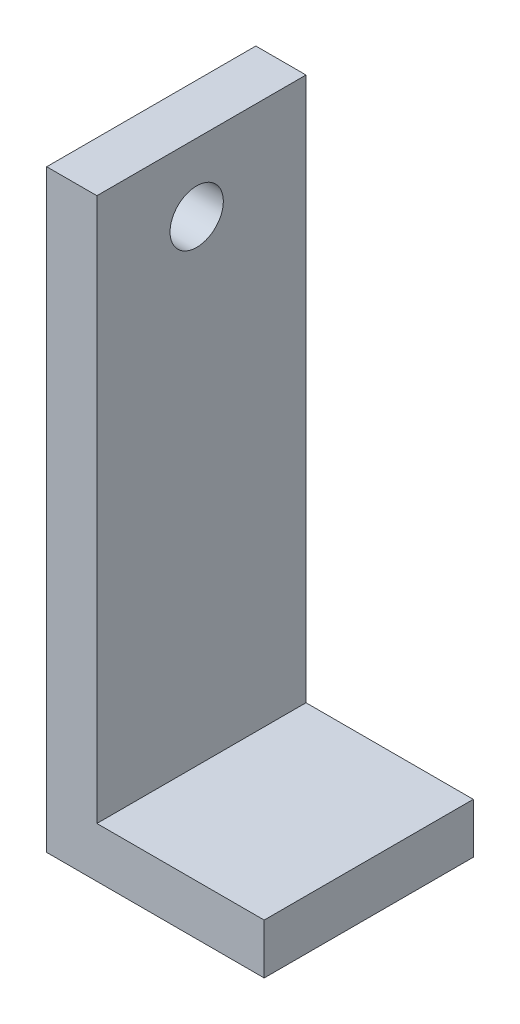
ISO-10303-21;
HEADER;
FILE_DESCRIPTION(('STEP AP214'),'2;1');
FILE_NAME('part.step','',(''),(''),'','','');
FILE_SCHEMA(('AUTOMOTIVE_DESIGN { 1 0 10303 214 1 1 1 1 }'));
ENDSEC;
DATA;
#1=APPLICATION_CONTEXT('core data for automotive mechanical design processes');
#2=APPLICATION_PROTOCOL_DEFINITION('international standard','automotive_design',2000,#1);
#3=PRODUCT_CONTEXT('',#1,'mechanical');
#4=PRODUCT('Part','Part','',(#3));
#5=PRODUCT_RELATED_PRODUCT_CATEGORY('part','',(#4));
#6=PRODUCT_DEFINITION_FORMATION('','',#4);
#7=PRODUCT_DEFINITION_CONTEXT('part definition',#1,'design');
#8=PRODUCT_DEFINITION('design','',#6,#7);
#9=PRODUCT_DEFINITION_SHAPE('','',#8);
#10=(LENGTH_UNIT() NAMED_UNIT(*) SI_UNIT(.MILLI.,.METRE.));
#11=(NAMED_UNIT(*) PLANE_ANGLE_UNIT() SI_UNIT($,.RADIAN.));
#12=(NAMED_UNIT(*) SI_UNIT($,.STERADIAN.) SOLID_ANGLE_UNIT());
#13=UNCERTAINTY_MEASURE_WITH_UNIT(LENGTH_MEASURE(1.E-05),#10,'distance_accuracy_value','');
#14=(GEOMETRIC_REPRESENTATION_CONTEXT(3) GLOBAL_UNCERTAINTY_ASSIGNED_CONTEXT((#13)) GLOBAL_UNIT_ASSIGNED_CONTEXT((#10,
#11,#12)) REPRESENTATION_CONTEXT('',''));
#15=CARTESIAN_POINT('',(0.,0.,0.));
#16=DIRECTION('',(0.,0.,1.));
#17=DIRECTION('',(1.,0.,0.));
#18=AXIS2_PLACEMENT_3D('',#15,#16,#17);
#19=CARTESIAN_POINT('',(6.,0.,0.));
#20=DIRECTION('',(-1.,0.,0.));
#21=DIRECTION('',(0.,0.,1.));
#22=AXIS2_PLACEMENT_3D('',#19,#20,#21);
#23=PLANE('',#22);
#24=CARTESIAN_POINT('',(6.,-8.12949452055312,13.0702188641551));
#25=DIRECTION('',(1.,0.,0.));
#26=DIRECTION('',(0.,0.,-1.));
#27=AXIS2_PLACEMENT_3D('',#24,#25,#26);
#28=CIRCLE('',#27,3.18762035575905);
#29=CARTESIAN_POINT('',(6.,-8.12949452055312,9.88259850839609));
#30=VERTEX_POINT('',#29);
#31=EDGE_CURVE('E170',#30,#30,#28,.T.);
#32=ORIENTED_EDGE('',*,*,#31,.F.);
#33=EDGE_LOOP('',(#32));
#34=FACE_BOUND('',#33,.T.);
#35=DIRECTION('',(0.,0.,1.));
#36=VECTOR('',#35,1.);
#37=CARTESIAN_POINT('',(6.,-65.,25.));
#38=LINE('',#37,#36);
#39=CARTESIAN_POINT('',(6.,-65.,0.));
#40=VERTEX_POINT('',#39);
#41=CARTESIAN_POINT('',(6.,-65.,25.));
#42=VERTEX_POINT('',#41);
#43=EDGE_CURVE('E55',#40,#42,#38,.T.);
#44=ORIENTED_EDGE('',*,*,#43,.F.);
#45=DIRECTION('',(0.,1.,0.));
#46=VECTOR('',#45,1.);
#47=CARTESIAN_POINT('',(6.,0.,0.));
#48=LINE('',#47,#46);
#49=CARTESIAN_POINT('',(6.,0.,0.));
#50=VERTEX_POINT('',#49);
#51=EDGE_CURVE('E94',#40,#50,#48,.T.);
#52=ORIENTED_EDGE('',*,*,#51,.T.);
#53=DIRECTION('',(0.,0.,1.));
#54=VECTOR('',#53,1.);
#55=CARTESIAN_POINT('',(6.,0.,0.));
#56=LINE('',#55,#54);
#57=CARTESIAN_POINT('',(6.,0.,25.));
#58=VERTEX_POINT('',#57);
#59=EDGE_CURVE('E61',#50,#58,#56,.T.);
#60=ORIENTED_EDGE('',*,*,#59,.T.);
#61=DIRECTION('',(0.,-1.,0.));
#62=VECTOR('',#61,1.);
#63=CARTESIAN_POINT('',(6.,0.,25.));
#64=LINE('',#63,#62);
#65=EDGE_CURVE('E106',#58,#42,#64,.T.);
#66=ORIENTED_EDGE('',*,*,#65,.T.);
#67=EDGE_LOOP('',(#44,#52,#60,#66));
#68=FACE_BOUND('',#67,.T.);
#69=ADVANCED_FACE('F38',(#34,#68),#23,.F.);
#70=CARTESIAN_POINT('',(6.,0.,0.));
#71=DIRECTION('',(0.,0.,1.));
#72=DIRECTION('',(0.,-1.,0.));
#73=AXIS2_PLACEMENT_3D('',#70,#71,#72);
#74=PLANE('',#73);
#75=DIRECTION('',(0.,1.,0.));
#76=VECTOR('',#75,1.);
#77=CARTESIAN_POINT('',(0.,0.,0.));
#78=LINE('',#77,#76);
#79=CARTESIAN_POINT('',(0.,-71.,0.));
#80=VERTEX_POINT('',#79);
#81=CARTESIAN_POINT('',(0.,0.,0.));
#82=VERTEX_POINT('',#81);
#83=EDGE_CURVE('E101',#80,#82,#78,.T.);
#84=ORIENTED_EDGE('',*,*,#83,.T.);
#85=DIRECTION('',(-1.,0.,0.));
#86=VECTOR('',#85,1.);
#87=CARTESIAN_POINT('',(6.,0.,0.));
#88=LINE('',#87,#86);
#89=EDGE_CURVE('E11',#50,#82,#88,.T.);
#90=ORIENTED_EDGE('',*,*,#89,.F.);
#91=ORIENTED_EDGE('',*,*,#51,.F.);
#92=DIRECTION('',(-1.,0.,0.));
#93=VECTOR('',#92,1.);
#94=CARTESIAN_POINT('',(26.,-65.,0.));
#95=LINE('',#94,#93);
#96=CARTESIAN_POINT('',(26.,-65.,0.));
#97=VERTEX_POINT('',#96);
#98=EDGE_CURVE('E111',#97,#40,#95,.T.);
#99=ORIENTED_EDGE('',*,*,#98,.F.);
#100=DIRECTION('',(0.,1.,0.));
#101=VECTOR('',#100,1.);
#102=CARTESIAN_POINT('',(26.,-71.,0.));
#103=LINE('',#102,#101);
#104=CARTESIAN_POINT('',(26.,-71.,0.));
#105=VERTEX_POINT('',#104);
#106=EDGE_CURVE('E104',#105,#97,#103,.T.);
#107=ORIENTED_EDGE('',*,*,#106,.F.);
#108=DIRECTION('',(-1.,0.,0.));
#109=VECTOR('',#108,1.);
#110=CARTESIAN_POINT('',(6.,-71.,0.));
#111=LINE('',#110,#109);
#112=EDGE_CURVE('E86',#105,#80,#111,.T.);
#113=ORIENTED_EDGE('',*,*,#112,.T.);
#114=EDGE_LOOP('',(#84,#90,#91,#99,#107,#113));
#115=FACE_BOUND('',#114,.T.);
#116=ADVANCED_FACE('F40',(#115),#74,.F.);
#117=CARTESIAN_POINT('',(6.,0.,0.));
#118=DIRECTION('',(0.,-1.,0.));
#119=DIRECTION('',(0.,0.,-1.));
#120=AXIS2_PLACEMENT_3D('',#117,#118,#119);
#121=PLANE('',#120);
#122=DIRECTION('',(0.,0.,1.));
#123=VECTOR('',#122,1.);
#124=CARTESIAN_POINT('',(0.,0.,0.));
#125=LINE('',#124,#123);
#126=CARTESIAN_POINT('',(0.,0.,25.));
#127=VERTEX_POINT('',#126);
#128=EDGE_CURVE('E109',#82,#127,#125,.T.);
#129=ORIENTED_EDGE('',*,*,#128,.T.);
#130=DIRECTION('',(-1.,0.,0.));
#131=VECTOR('',#130,1.);
#132=CARTESIAN_POINT('',(6.,0.,25.));
#133=LINE('',#132,#131);
#134=EDGE_CURVE('E48',#58,#127,#133,.T.);
#135=ORIENTED_EDGE('',*,*,#134,.F.);
#136=ORIENTED_EDGE('',*,*,#59,.F.);
#137=ORIENTED_EDGE('',*,*,#89,.T.);
#138=EDGE_LOOP('',(#129,#135,#136,#137));
#139=FACE_BOUND('',#138,.T.);
#140=ADVANCED_FACE('F133',(#139),#121,.F.);
#141=CARTESIAN_POINT('',(6.,0.,25.));
#142=DIRECTION('',(0.,0.,-1.));
#143=DIRECTION('',(0.,1.,0.));
#144=AXIS2_PLACEMENT_3D('',#141,#142,#143);
#145=PLANE('',#144);
#146=DIRECTION('',(0.,-1.,0.));
#147=VECTOR('',#146,1.);
#148=CARTESIAN_POINT('',(0.,0.,25.));
#149=LINE('',#148,#147);
#150=CARTESIAN_POINT('',(0.,-71.,25.));
#151=VERTEX_POINT('',#150);
#152=EDGE_CURVE('E95',#127,#151,#149,.T.);
#153=ORIENTED_EDGE('',*,*,#152,.T.);
#154=DIRECTION('',(-1.,0.,0.));
#155=VECTOR('',#154,1.);
#156=CARTESIAN_POINT('',(6.,-71.,25.));
#157=LINE('',#156,#155);
#158=CARTESIAN_POINT('',(26.,-71.,25.));
#159=VERTEX_POINT('',#158);
#160=EDGE_CURVE('E89',#159,#151,#157,.T.);
#161=ORIENTED_EDGE('',*,*,#160,.F.);
#162=DIRECTION('',(0.,-1.,0.));
#163=VECTOR('',#162,1.);
#164=CARTESIAN_POINT('',(26.,-71.,25.));
#165=LINE('',#164,#163);
#166=CARTESIAN_POINT('',(26.,-65.,25.));
#167=VERTEX_POINT('',#166);
#168=EDGE_CURVE('E158',#167,#159,#165,.T.);
#169=ORIENTED_EDGE('',*,*,#168,.F.);
#170=DIRECTION('',(-1.,0.,0.));
#171=VECTOR('',#170,1.);
#172=CARTESIAN_POINT('',(26.,-65.,25.));
#173=LINE('',#172,#171);
#174=EDGE_CURVE('E117',#167,#42,#173,.T.);
#175=ORIENTED_EDGE('',*,*,#174,.T.);
#176=ORIENTED_EDGE('',*,*,#65,.F.);
#177=ORIENTED_EDGE('',*,*,#134,.T.);
#178=EDGE_LOOP('',(#153,#161,#169,#175,#176,#177));
#179=FACE_BOUND('',#178,.T.);
#180=ADVANCED_FACE('F130',(#179),#145,.F.);
#181=CARTESIAN_POINT('',(6.,-71.,0.));
#182=DIRECTION('',(0.,1.,0.));
#183=DIRECTION('',(0.,0.,1.));
#184=AXIS2_PLACEMENT_3D('',#181,#182,#183);
#185=PLANE('',#184);
#186=DIRECTION('',(0.,0.,-1.));
#187=VECTOR('',#186,1.);
#188=CARTESIAN_POINT('',(0.,-71.,0.));
#189=LINE('',#188,#187);
#190=EDGE_CURVE('E81',#151,#80,#189,.T.);
#191=ORIENTED_EDGE('',*,*,#190,.T.);
#192=ORIENTED_EDGE('',*,*,#112,.F.);
#193=DIRECTION('',(0.,0.,-1.));
#194=VECTOR('',#193,1.);
#195=CARTESIAN_POINT('',(26.,-71.,25.));
#196=LINE('',#195,#194);
#197=EDGE_CURVE('E153',#159,#105,#196,.T.);
#198=ORIENTED_EDGE('',*,*,#197,.F.);
#199=ORIENTED_EDGE('',*,*,#160,.T.);
#200=EDGE_LOOP('',(#191,#192,#198,#199));
#201=FACE_BOUND('',#200,.T.);
#202=ADVANCED_FACE('F83',(#201),#185,.F.);
#203=CARTESIAN_POINT('',(0.,0.,0.));
#204=DIRECTION('',(-1.,0.,0.));
#205=DIRECTION('',(0.,0.,1.));
#206=AXIS2_PLACEMENT_3D('',#203,#204,#205);
#207=PLANE('',#206);
#208=CARTESIAN_POINT('',(0.,-8.12949452055312,13.0702188641551));
#209=DIRECTION('',(-1.,0.,0.));
#210=DIRECTION('',(0.,0.,1.));
#211=AXIS2_PLACEMENT_3D('',#208,#209,#210);
#212=CIRCLE('',#211,3.18762035575905);
#213=CARTESIAN_POINT('',(0.,-8.12949452055312,9.88259850839609));
#214=VERTEX_POINT('',#213);
#215=EDGE_CURVE('E42',#214,#214,#212,.T.);
#216=ORIENTED_EDGE('',*,*,#215,.F.);
#217=EDGE_LOOP('',(#216));
#218=FACE_BOUND('',#217,.T.);
#219=ORIENTED_EDGE('',*,*,#83,.F.);
#220=ORIENTED_EDGE('',*,*,#190,.F.);
#221=ORIENTED_EDGE('',*,*,#152,.F.);
#222=ORIENTED_EDGE('',*,*,#128,.F.);
#223=EDGE_LOOP('',(#219,#220,#221,#222));
#224=FACE_BOUND('',#223,.T.);
#225=ADVANCED_FACE('F108',(#218,#224),#207,.T.);
#226=CARTESIAN_POINT('',(26.,-65.,25.));
#227=DIRECTION('',(0.,-1.,0.));
#228=DIRECTION('',(0.,0.,-1.));
#229=AXIS2_PLACEMENT_3D('',#226,#227,#228);
#230=PLANE('',#229);
#231=ORIENTED_EDGE('',*,*,#43,.T.);
#232=ORIENTED_EDGE('',*,*,#174,.F.);
#233=DIRECTION('',(0.,0.,1.));
#234=VECTOR('',#233,1.);
#235=CARTESIAN_POINT('',(26.,-65.,25.));
#236=LINE('',#235,#234);
#237=EDGE_CURVE('E143',#97,#167,#236,.T.);
#238=ORIENTED_EDGE('',*,*,#237,.F.);
#239=ORIENTED_EDGE('',*,*,#98,.T.);
#240=EDGE_LOOP('',(#231,#232,#238,#239));
#241=FACE_BOUND('',#240,.T.);
#242=ADVANCED_FACE('F139',(#241),#230,.F.);
#243=CARTESIAN_POINT('',(26.,0.,0.));
#244=DIRECTION('',(-1.,0.,0.));
#245=DIRECTION('',(0.,0.,1.));
#246=AXIS2_PLACEMENT_3D('',#243,#244,#245);
#247=PLANE('',#246);
#248=ORIENTED_EDGE('',*,*,#168,.T.);
#249=ORIENTED_EDGE('',*,*,#197,.T.);
#250=ORIENTED_EDGE('',*,*,#106,.T.);
#251=ORIENTED_EDGE('',*,*,#237,.T.);
#252=EDGE_LOOP('',(#248,#249,#250,#251));
#253=FACE_BOUND('',#252,.T.);
#254=ADVANCED_FACE('F166',(#253),#247,.F.);
#255=CARTESIAN_POINT('',(-16.5,-8.12949452055312,13.0702188641551));
#256=DIRECTION('',(1.,0.,0.));
#257=DIRECTION('',(0.,0.,-1.));
#258=AXIS2_PLACEMENT_3D('',#255,#256,#257);
#259=CYLINDRICAL_SURFACE('',#258,3.18762035575905);
#260=CARTESIAN_POINT('',(0.,-8.12949452055312,9.88259850839609));
#261=CARTESIAN_POINT('',(0.0625000000000035,-8.12949452055312,9.88259850839609));
#262=CARTESIAN_POINT('',(0.125000000000004,-8.12949452055312,9.88259850839609));
#263=CARTESIAN_POINT('',(0.250000000000004,-8.12949452055312,9.88259850839609));
#264=CARTESIAN_POINT('',(0.312500000000004,-8.12949452055312,9.88259850839609));
#265=CARTESIAN_POINT('',(0.437500000000004,-8.12949452055312,9.88259850839609));
#266=CARTESIAN_POINT('',(0.500000000000004,-8.12949452055312,9.88259850839609));
#267=CARTESIAN_POINT('',(0.625000000000004,-8.12949452055312,9.88259850839609));
#268=CARTESIAN_POINT('',(0.687500000000004,-8.12949452055312,9.88259850839609));
#269=CARTESIAN_POINT('',(0.812500000000004,-8.12949452055312,9.88259850839609));
#270=CARTESIAN_POINT('',(0.875000000000004,-8.12949452055312,9.88259850839609));
#271=CARTESIAN_POINT('',(1.,-8.12949452055312,9.88259850839609));
#272=CARTESIAN_POINT('',(1.0625,-8.12949452055312,9.88259850839609));
#273=CARTESIAN_POINT('',(1.1875,-8.12949452055312,9.88259850839609));
#274=CARTESIAN_POINT('',(1.25,-8.12949452055312,9.88259850839609));
#275=CARTESIAN_POINT('',(1.375,-8.12949452055312,9.88259850839609));
#276=CARTESIAN_POINT('',(1.4375,-8.12949452055312,9.88259850839609));
#277=CARTESIAN_POINT('',(1.5625,-8.12949452055312,9.88259850839609));
#278=CARTESIAN_POINT('',(1.625,-8.12949452055312,9.88259850839609));
#279=CARTESIAN_POINT('',(1.75,-8.12949452055312,9.88259850839609));
#280=CARTESIAN_POINT('',(1.8125,-8.12949452055312,9.88259850839609));
#281=CARTESIAN_POINT('',(1.9375,-8.12949452055312,9.88259850839609));
#282=CARTESIAN_POINT('',(2.,-8.12949452055312,9.88259850839609));
#283=CARTESIAN_POINT('',(2.125,-8.12949452055312,9.88259850839609));
#284=CARTESIAN_POINT('',(2.1875,-8.12949452055312,9.88259850839609));
#285=CARTESIAN_POINT('',(2.3125,-8.12949452055312,9.88259850839609));
#286=CARTESIAN_POINT('',(2.375,-8.12949452055312,9.88259850839609));
#287=CARTESIAN_POINT('',(2.5,-8.12949452055312,9.88259850839609));
#288=CARTESIAN_POINT('',(2.5625,-8.12949452055312,9.88259850839609));
#289=CARTESIAN_POINT('',(2.6875,-8.12949452055312,9.88259850839609));
#290=CARTESIAN_POINT('',(2.75,-8.12949452055312,9.88259850839609));
#291=CARTESIAN_POINT('',(2.875,-8.12949452055312,9.88259850839609));
#292=CARTESIAN_POINT('',(2.9375,-8.12949452055312,9.88259850839609));
#293=CARTESIAN_POINT('',(3.0625,-8.12949452055312,9.88259850839609));
#294=CARTESIAN_POINT('',(3.125,-8.12949452055312,9.88259850839609));
#295=CARTESIAN_POINT('',(3.25,-8.12949452055312,9.88259850839609));
#296=CARTESIAN_POINT('',(3.3125,-8.12949452055312,9.88259850839609));
#297=CARTESIAN_POINT('',(3.4375,-8.12949452055312,9.88259850839609));
#298=CARTESIAN_POINT('',(3.5,-8.12949452055312,9.88259850839609));
#299=CARTESIAN_POINT('',(3.625,-8.12949452055312,9.88259850839609));
#300=CARTESIAN_POINT('',(3.6875,-8.12949452055312,9.88259850839609));
#301=CARTESIAN_POINT('',(3.8125,-8.12949452055312,9.88259850839609));
#302=CARTESIAN_POINT('',(3.875,-8.12949452055312,9.88259850839609));
#303=CARTESIAN_POINT('',(4.,-8.12949452055312,9.88259850839609));
#304=CARTESIAN_POINT('',(4.0625,-8.12949452055312,9.88259850839609));
#305=CARTESIAN_POINT('',(4.1875,-8.12949452055312,9.88259850839609));
#306=CARTESIAN_POINT('',(4.25,-8.12949452055312,9.88259850839609));
#307=CARTESIAN_POINT('',(4.375,-8.12949452055312,9.88259850839609));
#308=CARTESIAN_POINT('',(4.4375,-8.12949452055312,9.88259850839609));
#309=CARTESIAN_POINT('',(4.5625,-8.12949452055312,9.88259850839609));
#310=CARTESIAN_POINT('',(4.625,-8.12949452055312,9.88259850839609));
#311=CARTESIAN_POINT('',(4.75,-8.12949452055312,9.88259850839609));
#312=CARTESIAN_POINT('',(4.8125,-8.12949452055312,9.88259850839609));
#313=CARTESIAN_POINT('',(4.9375,-8.12949452055312,9.88259850839609));
#314=CARTESIAN_POINT('',(5.,-8.12949452055312,9.88259850839609));
#315=CARTESIAN_POINT('',(5.125,-8.12949452055312,9.88259850839609));
#316=CARTESIAN_POINT('',(5.1875,-8.12949452055312,9.88259850839609));
#317=CARTESIAN_POINT('',(5.3125,-8.12949452055312,9.88259850839609));
#318=CARTESIAN_POINT('',(5.375,-8.12949452055312,9.88259850839609));
#319=CARTESIAN_POINT('',(5.5,-8.12949452055312,9.88259850839609));
#320=CARTESIAN_POINT('',(5.5625,-8.12949452055312,9.88259850839609));
#321=CARTESIAN_POINT('',(5.6875,-8.12949452055312,9.88259850839609));
#322=CARTESIAN_POINT('',(5.75,-8.12949452055312,9.88259850839609));
#323=CARTESIAN_POINT('',(5.875,-8.12949452055312,9.88259850839609));
#324=CARTESIAN_POINT('',(5.9375,-8.12949452055312,9.88259850839609));
#325=CARTESIAN_POINT('',(6.,-8.12949452055312,9.88259850839609));
#326=B_SPLINE_CURVE_WITH_KNOTS('',3,(#260,#261,#262,#263,#264,#265,#266,#267,#268,#269,#270,
#271,#272,#273,#274,#275,#276,#277,#278,#279,#280,#281,#282,#283,#284,#285,#286,#287,#288,#289,
#290,#291,#292,#293,#294,#295,#296,#297,#298,#299,#300,#301,#302,#303,#304,#305,#306,#307,#308,
#309,#310,#311,#312,#313,#314,#315,#316,#317,#318,#319,#320,#321,#322,#323,#324,#325),
.UNSPECIFIED.,.F.,.F.,(4,2,2,2,2,2,2,2,2,2,2,2,2,2,2,2,2,2,2,2,2,2,2,2,2,2,2,2,2,2,2,2,4),(0.,
0.1875,0.375,0.5625,0.750000000000001,0.937500000000001,1.125,1.3125,1.5,1.6875,1.875,2.0625,
2.25,2.4375,2.625,2.8125,3.,3.1875,3.375,3.5625,3.75,3.9375,4.125,4.3125,4.5,4.6875,4.875,
5.0625,5.25,5.4375,5.625,5.8125,6.),.UNSPECIFIED.);
#327=EDGE_CURVE('BSEAM179',#214,#30,#326,.T.);
#328=ORIENTED_EDGE('',*,*,#215,.T.);
#329=ORIENTED_EDGE('',*,*,#31,.T.);
#330=ORIENTED_EDGE('',*,*,#327,.T.);
#331=ORIENTED_EDGE('',*,*,#327,.F.);
#332=EDGE_LOOP('',(#328,#330,#329,#331));
#333=FACE_BOUND('',#332,.T.);
#334=ADVANCED_FACE('F179',(#333),#259,.F.);
#335=CLOSED_SHELL('',(#69,#116,#140,#180,#202,#225,#242,#254,#334));
#336=MANIFOLD_SOLID_BREP('B2',#335);
#337=ADVANCED_BREP_SHAPE_REPRESENTATION('',(#18,#336),#14);
#338=SHAPE_DEFINITION_REPRESENTATION(#9,#337);
ENDSEC;
END-ISO-10303-21;
